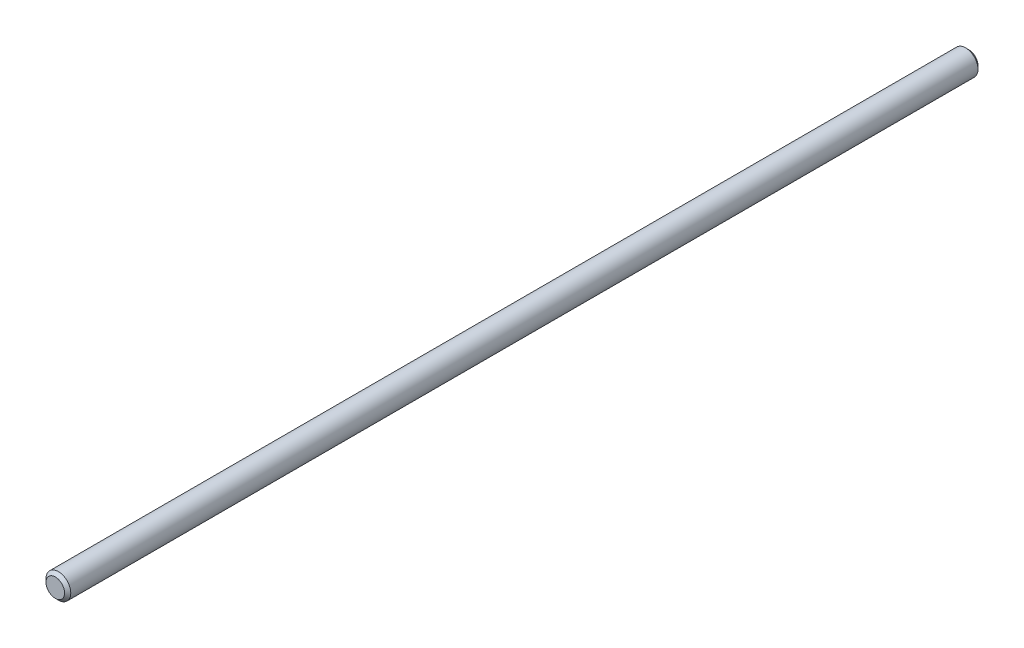
ISO-10303-21;
HEADER;
FILE_DESCRIPTION(('STEP AP214'),'2;1');
FILE_NAME('part.step','',(''),(''),'','','');
FILE_SCHEMA(('AUTOMOTIVE_DESIGN { 1 0 10303 214 1 1 1 1 }'));
ENDSEC;
DATA;
#1=APPLICATION_CONTEXT('core data for automotive mechanical design processes');
#2=APPLICATION_PROTOCOL_DEFINITION('international standard','automotive_design',2000,#1);
#3=PRODUCT_CONTEXT('',#1,'mechanical');
#4=PRODUCT('Part','Part','',(#3));
#5=PRODUCT_RELATED_PRODUCT_CATEGORY('part','',(#4));
#6=PRODUCT_DEFINITION_FORMATION('','',#4);
#7=PRODUCT_DEFINITION_CONTEXT('part definition',#1,'design');
#8=PRODUCT_DEFINITION('design','',#6,#7);
#9=PRODUCT_DEFINITION_SHAPE('','',#8);
#10=(LENGTH_UNIT() NAMED_UNIT(*) SI_UNIT(.MILLI.,.METRE.));
#11=(NAMED_UNIT(*) PLANE_ANGLE_UNIT() SI_UNIT($,.RADIAN.));
#12=(NAMED_UNIT(*) SI_UNIT($,.STERADIAN.) SOLID_ANGLE_UNIT());
#13=UNCERTAINTY_MEASURE_WITH_UNIT(LENGTH_MEASURE(1.E-05),#10,'distance_accuracy_value','');
#14=(GEOMETRIC_REPRESENTATION_CONTEXT(3) GLOBAL_UNCERTAINTY_ASSIGNED_CONTEXT((#13)) GLOBAL_UNIT_ASSIGNED_CONTEXT((#10,
#11,#12)) REPRESENTATION_CONTEXT('',''));
#15=CARTESIAN_POINT('',(0.,0.,0.));
#16=DIRECTION('',(0.,0.,1.));
#17=DIRECTION('',(1.,0.,0.));
#18=AXIS2_PLACEMENT_3D('',#15,#16,#17);
#19=CARTESIAN_POINT('',(0.,0.,295.));
#20=DIRECTION('',(0.,0.,-1.));
#21=DIRECTION('',(-1.,0.,0.));
#22=AXIS2_PLACEMENT_3D('',#19,#20,#21);
#23=CYLINDRICAL_SURFACE('',#22,4.);
#24=CARTESIAN_POINT('',(0.,0.,294.));
#25=DIRECTION('',(0.,0.,1.));
#26=DIRECTION('',(1.,0.,0.));
#27=AXIS2_PLACEMENT_3D('',#24,#25,#26);
#28=CIRCLE('',#27,4.);
#29=CARTESIAN_POINT('',(4.,0.,294.));
#30=VERTEX_POINT('',#29);
#31=EDGE_CURVE('E40',#30,#30,#28,.F.);
#32=ORIENTED_EDGE('',*,*,#31,.T.);
#33=EDGE_LOOP('',(#32));
#34=FACE_BOUND('',#33,.T.);
#35=CARTESIAN_POINT('',(0.,0.,0.999999999999945));
#36=DIRECTION('',(0.,0.,1.));
#37=DIRECTION('',(1.,0.,0.));
#38=AXIS2_PLACEMENT_3D('',#35,#36,#37);
#39=CIRCLE('',#38,4.);
#40=CARTESIAN_POINT('',(4.,0.,0.999999999999945));
#41=VERTEX_POINT('',#40);
#42=EDGE_CURVE('E44',#41,#41,#39,.T.);
#43=ORIENTED_EDGE('',*,*,#42,.T.);
#44=EDGE_LOOP('',(#43));
#45=FACE_BOUND('',#44,.T.);
#46=ADVANCED_FACE('F33',(#34,#45),#23,.T.);
#47=CARTESIAN_POINT('',(0.,0.,295.));
#48=DIRECTION('',(0.,0.,1.));
#49=DIRECTION('',(1.,0.,0.));
#50=AXIS2_PLACEMENT_3D('',#47,#48,#49);
#51=PLANE('',#50);
#52=CARTESIAN_POINT('',(0.,0.,295.));
#53=DIRECTION('',(0.,0.,1.));
#54=DIRECTION('',(1.,0.,0.));
#55=AXIS2_PLACEMENT_3D('',#52,#53,#54);
#56=CIRCLE('',#55,2.99999999999998);
#57=CARTESIAN_POINT('',(2.99999999999998,0.,295.));
#58=VERTEX_POINT('',#57);
#59=EDGE_CURVE('E48',#58,#58,#56,.T.);
#60=ORIENTED_EDGE('',*,*,#59,.T.);
#61=EDGE_LOOP('',(#60));
#62=FACE_BOUND('',#61,.T.);
#63=ADVANCED_FACE('F54',(#62),#51,.T.);
#64=CARTESIAN_POINT('',(0.,0.,0.));
#65=DIRECTION('',(0.,0.,1.));
#66=DIRECTION('',(1.,0.,0.));
#67=AXIS2_PLACEMENT_3D('',#64,#65,#66);
#68=PLANE('',#67);
#69=CARTESIAN_POINT('',(0.,0.,0.));
#70=DIRECTION('',(0.,0.,1.));
#71=DIRECTION('',(1.,0.,0.));
#72=AXIS2_PLACEMENT_3D('',#69,#70,#71);
#73=CIRCLE('',#72,3.00000000000006);
#74=CARTESIAN_POINT('',(3.00000000000006,0.,0.));
#75=VERTEX_POINT('',#74);
#76=EDGE_CURVE('E10',#75,#75,#73,.F.);
#77=ORIENTED_EDGE('',*,*,#76,.T.);
#78=EDGE_LOOP('',(#77));
#79=FACE_BOUND('',#78,.T.);
#80=ADVANCED_FACE('F58',(#79),#68,.F.);
#81=CARTESIAN_POINT('',(0.,0.,295.));
#82=DIRECTION('',(0.,0.,-1.));
#83=DIRECTION('',(-1.,0.,0.));
#84=AXIS2_PLACEMENT_3D('',#81,#82,#83);
#85=CONICAL_SURFACE('',#84,2.99999999999998,0.78539816339746);
#86=ORIENTED_EDGE('',*,*,#31,.F.);
#87=EDGE_LOOP('',(#86));
#88=FACE_BOUND('',#87,.T.);
#89=ORIENTED_EDGE('',*,*,#59,.F.);
#90=EDGE_LOOP('',(#89));
#91=FACE_BOUND('',#90,.T.);
#92=ADVANCED_FACE('F56',(#88,#91),#85,.T.);
#93=CARTESIAN_POINT('',(0.,0.,0.999999999999945));
#94=DIRECTION('',(0.,0.,1.));
#95=DIRECTION('',(1.,0.,0.));
#96=AXIS2_PLACEMENT_3D('',#93,#94,#95);
#97=CONICAL_SURFACE('',#96,4.,0.785398163397447);
#98=ORIENTED_EDGE('',*,*,#76,.F.);
#99=EDGE_LOOP('',(#98));
#100=FACE_BOUND('',#99,.T.);
#101=ORIENTED_EDGE('',*,*,#42,.F.);
#102=EDGE_LOOP('',(#101));
#103=FACE_BOUND('',#102,.T.);
#104=ADVANCED_FACE('F35',(#100,#103),#97,.T.);
#105=CLOSED_SHELL('',(#46,#63,#80,#92,#104));
#106=MANIFOLD_SOLID_BREP('B2',#105);
#107=ADVANCED_BREP_SHAPE_REPRESENTATION('',(#18,#106),#14);
#108=SHAPE_DEFINITION_REPRESENTATION(#9,#107);
ENDSEC;
END-ISO-10303-21;
